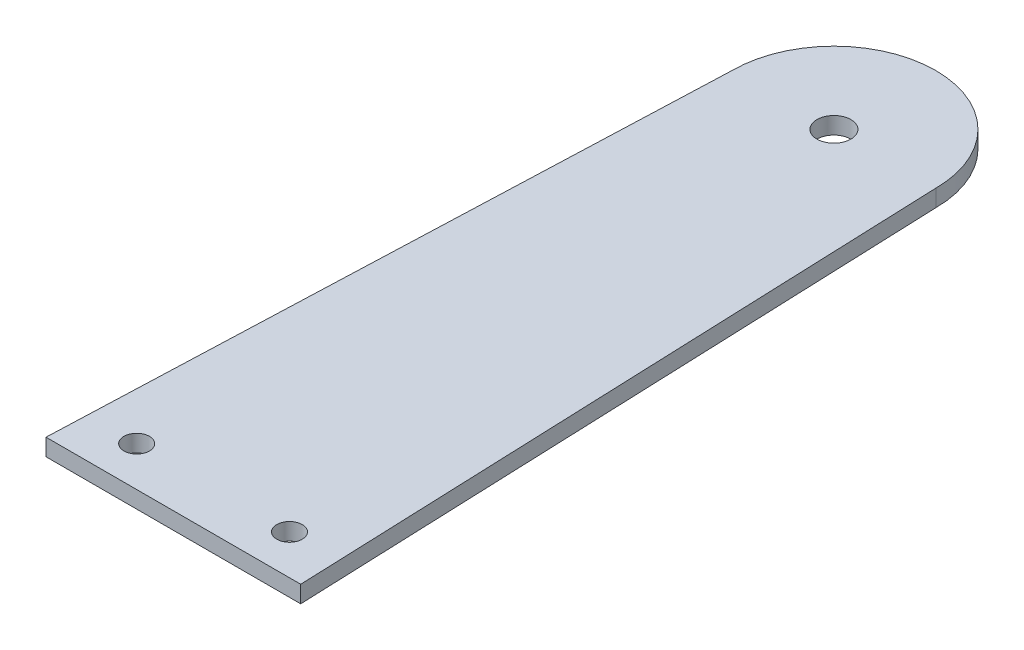
ISO-10303-21;
HEADER;
FILE_DESCRIPTION(('STEP AP214'),'2;1');
FILE_NAME('part.step','',(''),(''),'','','');
FILE_SCHEMA(('AUTOMOTIVE_DESIGN { 1 0 10303 214 1 1 1 1 }'));
ENDSEC;
DATA;
#1=APPLICATION_CONTEXT('core data for automotive mechanical design processes');
#2=APPLICATION_PROTOCOL_DEFINITION('international standard','automotive_design',2000,#1);
#3=PRODUCT_CONTEXT('',#1,'mechanical');
#4=PRODUCT('Part','Part','',(#3));
#5=PRODUCT_RELATED_PRODUCT_CATEGORY('part','',(#4));
#6=PRODUCT_DEFINITION_FORMATION('','',#4);
#7=PRODUCT_DEFINITION_CONTEXT('part definition',#1,'design');
#8=PRODUCT_DEFINITION('design','',#6,#7);
#9=PRODUCT_DEFINITION_SHAPE('','',#8);
#10=(LENGTH_UNIT() NAMED_UNIT(*) SI_UNIT(.MILLI.,.METRE.));
#11=(NAMED_UNIT(*) PLANE_ANGLE_UNIT() SI_UNIT($,.RADIAN.));
#12=(NAMED_UNIT(*) SI_UNIT($,.STERADIAN.) SOLID_ANGLE_UNIT());
#13=UNCERTAINTY_MEASURE_WITH_UNIT(LENGTH_MEASURE(1.E-05),#10,'distance_accuracy_value','');
#14=(GEOMETRIC_REPRESENTATION_CONTEXT(3) GLOBAL_UNCERTAINTY_ASSIGNED_CONTEXT((#13)) GLOBAL_UNIT_ASSIGNED_CONTEXT((#10,
#11,#12)) REPRESENTATION_CONTEXT('',''));
#15=CARTESIAN_POINT('',(0.,0.,0.));
#16=DIRECTION('',(0.,0.,1.));
#17=DIRECTION('',(1.,0.,0.));
#18=AXIS2_PLACEMENT_3D('',#15,#16,#17);
#19=CARTESIAN_POINT('',(-2.62522791540278,2.,-48.1827211912994));
#20=DIRECTION('',(0.,1.,0.));
#21=DIRECTION('',(0.,0.,1.));
#22=AXIS2_PLACEMENT_3D('',#19,#20,#21);
#23=PLANE('',#22);
#24=CARTESIAN_POINT('',(6.37477208459722,2.,24.9379456374754));
#25=DIRECTION('',(0.,1.,0.));
#26=DIRECTION('',(0.,0.,1.));
#27=AXIS2_PLACEMENT_3D('',#24,#25,#26);
#28=CIRCLE('',#27,1.5);
#29=CARTESIAN_POINT('',(6.37477208459722,2.,26.4379456374754));
#30=VERTEX_POINT('',#29);
#31=EDGE_CURVE('E117',#30,#30,#28,.T.);
#32=ORIENTED_EDGE('',*,*,#31,.F.);
#33=EDGE_LOOP('',(#32));
#34=FACE_BOUND('',#33,.T.);
#35=DIRECTION('',(-0.0385317754008962,0.,0.999257375396577));
#36=VECTOR('',#35,1.);
#37=CARTESIAN_POINT('',(-14.6252279154028,2.,-48.1827211912994));
#38=LINE('',#37,#36);
#39=CARTESIAN_POINT('',(-14.6252279154028,2.,-48.1827211912994));
#40=VERTEX_POINT('',#39);
#41=CARTESIAN_POINT('',(-17.6252279154028,2.,29.6172788087006));
#42=VERTEX_POINT('',#41);
#43=EDGE_CURVE('E87',#40,#42,#38,.T.);
#44=ORIENTED_EDGE('',*,*,#43,.T.);
#45=DIRECTION('',(1.,0.,0.));
#46=VECTOR('',#45,1.);
#47=CARTESIAN_POINT('',(-17.6252279154028,2.,29.6172788087006));
#48=LINE('',#47,#46);
#49=CARTESIAN_POINT('',(12.3747720845972,2.,29.6172788087006));
#50=VERTEX_POINT('',#49);
#51=EDGE_CURVE('E82',#42,#50,#48,.T.);
#52=ORIENTED_EDGE('',*,*,#51,.T.);
#53=DIRECTION('',(-0.0385317754008962,0.,-0.999257375396577));
#54=VECTOR('',#53,1.);
#55=CARTESIAN_POINT('',(9.37477208459723,2.,-48.1827211912994));
#56=LINE('',#55,#54);
#57=CARTESIAN_POINT('',(9.37477208459723,2.,-48.1827211912994));
#58=VERTEX_POINT('',#57);
#59=EDGE_CURVE('E85',#50,#58,#56,.T.);
#60=ORIENTED_EDGE('',*,*,#59,.T.);
#61=CARTESIAN_POINT('',(-2.62522791540278,2.,-48.1827211912994));
#62=DIRECTION('',(0.,1.,0.));
#63=DIRECTION('',(0.,0.,1.));
#64=AXIS2_PLACEMENT_3D('',#61,#62,#63);
#65=CIRCLE('',#64,12.);
#66=EDGE_CURVE('E52',#58,#40,#65,.T.);
#67=ORIENTED_EDGE('',*,*,#66,.T.);
#68=EDGE_LOOP('',(#44,#52,#60,#67));
#69=FACE_BOUND('',#68,.T.);
#70=CARTESIAN_POINT('',(-11.6252279154028,2.,24.9379456374754));
#71=DIRECTION('',(0.,1.,0.));
#72=DIRECTION('',(0.,0.,1.));
#73=AXIS2_PLACEMENT_3D('',#70,#71,#72);
#74=CIRCLE('',#73,1.5);
#75=CARTESIAN_POINT('',(-11.6252279154028,2.,26.4379456374754));
#76=VERTEX_POINT('',#75);
#77=EDGE_CURVE('E102',#76,#76,#74,.T.);
#78=ORIENTED_EDGE('',*,*,#77,.F.);
#79=EDGE_LOOP('',(#78));
#80=FACE_BOUND('',#79,.T.);
#81=CARTESIAN_POINT('',(-2.62522791540278,2.,-48.1827211912994));
#82=DIRECTION('',(0.,1.,0.));
#83=DIRECTION('',(0.,0.,1.));
#84=AXIS2_PLACEMENT_3D('',#81,#82,#83);
#85=CIRCLE('',#84,2.);
#86=CARTESIAN_POINT('',(-2.62522791540278,2.,-46.1827211912994));
#87=VERTEX_POINT('',#86);
#88=EDGE_CURVE('E123',#87,#87,#85,.T.);
#89=ORIENTED_EDGE('',*,*,#88,.F.);
#90=EDGE_LOOP('',(#89));
#91=FACE_BOUND('',#90,.T.);
#92=ADVANCED_FACE('F35',(#34,#69,#80,#91),#23,.T.);
#93=CARTESIAN_POINT('',(-2.62522791540278,0.,-48.1827211912994));
#94=DIRECTION('',(0.,1.,0.));
#95=DIRECTION('',(0.,0.,1.));
#96=AXIS2_PLACEMENT_3D('',#93,#94,#95);
#97=PLANE('',#96);
#98=DIRECTION('',(-0.0385317754008962,0.,0.999257375396577));
#99=VECTOR('',#98,1.);
#100=CARTESIAN_POINT('',(-14.6252279154028,0.,-48.1827211912994));
#101=LINE('',#100,#99);
#102=CARTESIAN_POINT('',(-14.6252279154028,0.,-48.1827211912994));
#103=VERTEX_POINT('',#102);
#104=CARTESIAN_POINT('',(-17.6252279154028,0.,29.6172788087006));
#105=VERTEX_POINT('',#104);
#106=EDGE_CURVE('E99',#103,#105,#101,.T.);
#107=ORIENTED_EDGE('',*,*,#106,.F.);
#108=CARTESIAN_POINT('',(-2.62522791540278,0.,-48.1827211912994));
#109=DIRECTION('',(0.,1.,0.));
#110=DIRECTION('',(0.,0.,1.));
#111=AXIS2_PLACEMENT_3D('',#108,#109,#110);
#112=CIRCLE('',#111,12.);
#113=CARTESIAN_POINT('',(9.37477208459723,0.,-48.1827211912994));
#114=VERTEX_POINT('',#113);
#115=EDGE_CURVE('E75',#114,#103,#112,.T.);
#116=ORIENTED_EDGE('',*,*,#115,.F.);
#117=DIRECTION('',(-0.0385317754008962,0.,-0.999257375396577));
#118=VECTOR('',#117,1.);
#119=CARTESIAN_POINT('',(9.37477208459723,0.,-48.1827211912994));
#120=LINE('',#119,#118);
#121=CARTESIAN_POINT('',(12.3747720845972,0.,29.6172788087006));
#122=VERTEX_POINT('',#121);
#123=EDGE_CURVE('E69',#122,#114,#120,.T.);
#124=ORIENTED_EDGE('',*,*,#123,.F.);
#125=DIRECTION('',(1.,0.,0.));
#126=VECTOR('',#125,1.);
#127=CARTESIAN_POINT('',(-17.6252279154028,0.,29.6172788087006));
#128=LINE('',#127,#126);
#129=EDGE_CURVE('E91',#105,#122,#128,.T.);
#130=ORIENTED_EDGE('',*,*,#129,.F.);
#131=EDGE_LOOP('',(#107,#116,#124,#130));
#132=FACE_BOUND('',#131,.T.);
#133=CARTESIAN_POINT('',(-11.6252279154028,0.,24.9379456374754));
#134=DIRECTION('',(0.,1.,0.));
#135=DIRECTION('',(0.,0.,1.));
#136=AXIS2_PLACEMENT_3D('',#133,#134,#135);
#137=CIRCLE('',#136,1.5);
#138=CARTESIAN_POINT('',(-11.6252279154028,0.,26.4379456374754));
#139=VERTEX_POINT('',#138);
#140=EDGE_CURVE('E114',#139,#139,#137,.T.);
#141=ORIENTED_EDGE('',*,*,#140,.T.);
#142=EDGE_LOOP('',(#141));
#143=FACE_BOUND('',#142,.T.);
#144=CARTESIAN_POINT('',(6.37477208459722,0.,24.9379456374754));
#145=DIRECTION('',(0.,1.,0.));
#146=DIRECTION('',(0.,0.,1.));
#147=AXIS2_PLACEMENT_3D('',#144,#145,#146);
#148=CIRCLE('',#147,1.5);
#149=CARTESIAN_POINT('',(6.37477208459722,0.,26.4379456374754));
#150=VERTEX_POINT('',#149);
#151=EDGE_CURVE('E120',#150,#150,#148,.T.);
#152=ORIENTED_EDGE('',*,*,#151,.T.);
#153=EDGE_LOOP('',(#152));
#154=FACE_BOUND('',#153,.T.);
#155=CARTESIAN_POINT('',(-2.62522791540278,0.,-48.1827211912994));
#156=DIRECTION('',(0.,1.,0.));
#157=DIRECTION('',(0.,0.,1.));
#158=AXIS2_PLACEMENT_3D('',#155,#156,#157);
#159=CIRCLE('',#158,2.);
#160=CARTESIAN_POINT('',(-2.62522791540278,0.,-46.1827211912994));
#161=VERTEX_POINT('',#160);
#162=EDGE_CURVE('E126',#161,#161,#159,.T.);
#163=ORIENTED_EDGE('',*,*,#162,.T.);
#164=EDGE_LOOP('',(#163));
#165=FACE_BOUND('',#164,.T.);
#166=ADVANCED_FACE('F110',(#132,#143,#154,#165),#97,.F.);
#167=CARTESIAN_POINT('',(-14.6252279154028,2.,-48.1827211912994));
#168=DIRECTION('',(0.999257375396577,0.,0.0385317754008962));
#169=DIRECTION('',(0.0385317754008962,0.,-0.999257375396577));
#170=AXIS2_PLACEMENT_3D('',#167,#168,#169);
#171=PLANE('',#170);
#172=ORIENTED_EDGE('',*,*,#106,.T.);
#173=DIRECTION('',(0.,-1.,0.));
#174=VECTOR('',#173,1.);
#175=CARTESIAN_POINT('',(-17.6252279154028,2.,29.6172788087006));
#176=LINE('',#175,#174);
#177=EDGE_CURVE('E11',#42,#105,#176,.T.);
#178=ORIENTED_EDGE('',*,*,#177,.F.);
#179=ORIENTED_EDGE('',*,*,#43,.F.);
#180=DIRECTION('',(0.,-1.,0.));
#181=VECTOR('',#180,1.);
#182=CARTESIAN_POINT('',(-14.6252279154028,2.,-48.1827211912994));
#183=LINE('',#182,#181);
#184=EDGE_CURVE('E95',#40,#103,#183,.T.);
#185=ORIENTED_EDGE('',*,*,#184,.T.);
#186=EDGE_LOOP('',(#172,#178,#179,#185));
#187=FACE_BOUND('',#186,.T.);
#188=ADVANCED_FACE('F37',(#187),#171,.F.);
#189=CARTESIAN_POINT('',(-17.6252279154028,2.,29.6172788087006));
#190=DIRECTION('',(0.,0.,-1.));
#191=DIRECTION('',(-1.,0.,0.));
#192=AXIS2_PLACEMENT_3D('',#189,#190,#191);
#193=PLANE('',#192);
#194=ORIENTED_EDGE('',*,*,#129,.T.);
#195=DIRECTION('',(0.,-1.,0.));
#196=VECTOR('',#195,1.);
#197=CARTESIAN_POINT('',(12.3747720845972,2.,29.6172788087006));
#198=LINE('',#197,#196);
#199=EDGE_CURVE('E44',#50,#122,#198,.T.);
#200=ORIENTED_EDGE('',*,*,#199,.F.);
#201=ORIENTED_EDGE('',*,*,#51,.F.);
#202=ORIENTED_EDGE('',*,*,#177,.T.);
#203=EDGE_LOOP('',(#194,#200,#201,#202));
#204=FACE_BOUND('',#203,.T.);
#205=ADVANCED_FACE('F90',(#204),#193,.F.);
#206=CARTESIAN_POINT('',(9.37477208459723,2.,-48.1827211912994));
#207=DIRECTION('',(-0.999257375396577,0.,0.0385317754008962));
#208=DIRECTION('',(0.0385317754008962,0.,0.999257375396577));
#209=AXIS2_PLACEMENT_3D('',#206,#207,#208);
#210=PLANE('',#209);
#211=ORIENTED_EDGE('',*,*,#123,.T.);
#212=DIRECTION('',(0.,-1.,0.));
#213=VECTOR('',#212,1.);
#214=CARTESIAN_POINT('',(9.37477208459723,2.,-48.1827211912994));
#215=LINE('',#214,#213);
#216=EDGE_CURVE('E92',#58,#114,#215,.T.);
#217=ORIENTED_EDGE('',*,*,#216,.F.);
#218=ORIENTED_EDGE('',*,*,#59,.F.);
#219=ORIENTED_EDGE('',*,*,#199,.T.);
#220=EDGE_LOOP('',(#211,#217,#218,#219));
#221=FACE_BOUND('',#220,.T.);
#222=ADVANCED_FACE('F93',(#221),#210,.F.);
#223=CARTESIAN_POINT('',(-2.62522791540278,2.,-48.1827211912994));
#224=DIRECTION('',(0.,-1.,0.));
#225=DIRECTION('',(0.,0.,-1.));
#226=AXIS2_PLACEMENT_3D('',#223,#224,#225);
#227=CYLINDRICAL_SURFACE('',#226,12.);
#228=ORIENTED_EDGE('',*,*,#115,.T.);
#229=ORIENTED_EDGE('',*,*,#184,.F.);
#230=ORIENTED_EDGE('',*,*,#66,.F.);
#231=ORIENTED_EDGE('',*,*,#216,.T.);
#232=EDGE_LOOP('',(#228,#229,#230,#231));
#233=FACE_BOUND('',#232,.T.);
#234=ADVANCED_FACE('F107',(#233),#227,.T.);
#235=CARTESIAN_POINT('',(-11.6252279154028,2.,24.9379456374754));
#236=DIRECTION('',(0.,-1.,0.));
#237=DIRECTION('',(0.,0.,-1.));
#238=AXIS2_PLACEMENT_3D('',#235,#236,#237);
#239=CYLINDRICAL_SURFACE('',#238,1.5);
#240=ORIENTED_EDGE('',*,*,#77,.T.);
#241=EDGE_LOOP('',(#240));
#242=FACE_BOUND('',#241,.T.);
#243=ORIENTED_EDGE('',*,*,#140,.F.);
#244=EDGE_LOOP('',(#243));
#245=FACE_BOUND('',#244,.T.);
#246=ADVANCED_FACE('F144',(#242,#245),#239,.F.);
#247=CARTESIAN_POINT('',(6.37477208459722,2.,24.9379456374754));
#248=DIRECTION('',(0.,-1.,0.));
#249=DIRECTION('',(0.,0.,-1.));
#250=AXIS2_PLACEMENT_3D('',#247,#248,#249);
#251=CYLINDRICAL_SURFACE('',#250,1.5);
#252=ORIENTED_EDGE('',*,*,#31,.T.);
#253=EDGE_LOOP('',(#252));
#254=FACE_BOUND('',#253,.T.);
#255=ORIENTED_EDGE('',*,*,#151,.F.);
#256=EDGE_LOOP('',(#255));
#257=FACE_BOUND('',#256,.T.);
#258=ADVANCED_FACE('F190',(#254,#257),#251,.F.);
#259=CARTESIAN_POINT('',(-2.62522791540278,2.,-48.1827211912994));
#260=DIRECTION('',(0.,-1.,0.));
#261=DIRECTION('',(0.,0.,-1.));
#262=AXIS2_PLACEMENT_3D('',#259,#260,#261);
#263=CYLINDRICAL_SURFACE('',#262,2.);
#264=ORIENTED_EDGE('',*,*,#88,.T.);
#265=EDGE_LOOP('',(#264));
#266=FACE_BOUND('',#265,.T.);
#267=ORIENTED_EDGE('',*,*,#162,.F.);
#268=EDGE_LOOP('',(#267));
#269=FACE_BOUND('',#268,.T.);
#270=ADVANCED_FACE('F132',(#266,#269),#263,.F.);
#271=CLOSED_SHELL('',(#92,#166,#188,#205,#222,#234,#246,#258,#270));
#272=MANIFOLD_SOLID_BREP('B2',#271);
#273=ADVANCED_BREP_SHAPE_REPRESENTATION('',(#18,#272),#14);
#274=SHAPE_DEFINITION_REPRESENTATION(#9,#273);
ENDSEC;
END-ISO-10303-21;
